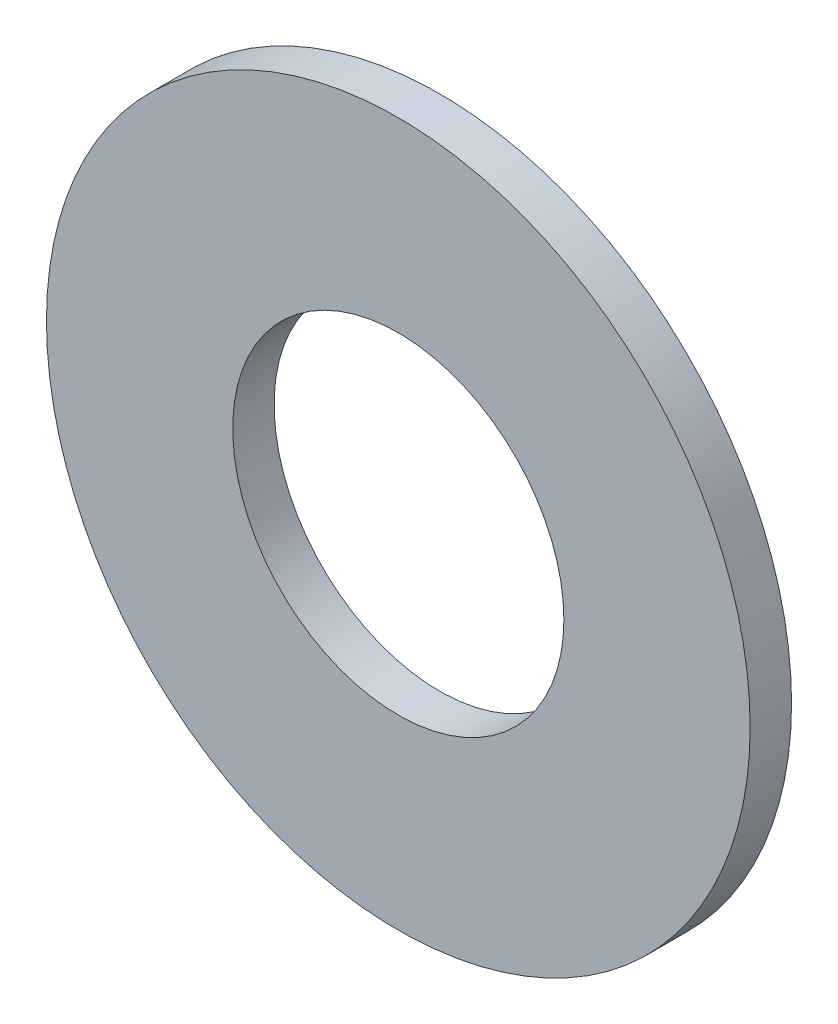
ISO-10303-21;
HEADER;
FILE_DESCRIPTION(('STEP AP214'),'2;1');
FILE_NAME('part.step','',(''),(''),'','','');
FILE_SCHEMA(('AUTOMOTIVE_DESIGN { 1 0 10303 214 1 1 1 1 }'));
ENDSEC;
DATA;
#1=APPLICATION_CONTEXT('core data for automotive mechanical design processes');
#2=APPLICATION_PROTOCOL_DEFINITION('international standard','automotive_design',2000,#1);
#3=PRODUCT_CONTEXT('',#1,'mechanical');
#4=PRODUCT('Part','Part','',(#3));
#5=PRODUCT_RELATED_PRODUCT_CATEGORY('part','',(#4));
#6=PRODUCT_DEFINITION_FORMATION('','',#4);
#7=PRODUCT_DEFINITION_CONTEXT('part definition',#1,'design');
#8=PRODUCT_DEFINITION('design','',#6,#7);
#9=PRODUCT_DEFINITION_SHAPE('','',#8);
#10=(LENGTH_UNIT() NAMED_UNIT(*) SI_UNIT(.MILLI.,.METRE.));
#11=(NAMED_UNIT(*) PLANE_ANGLE_UNIT() SI_UNIT($,.RADIAN.));
#12=(NAMED_UNIT(*) SI_UNIT($,.STERADIAN.) SOLID_ANGLE_UNIT());
#13=UNCERTAINTY_MEASURE_WITH_UNIT(LENGTH_MEASURE(1.E-05),#10,'distance_accuracy_value','');
#14=(GEOMETRIC_REPRESENTATION_CONTEXT(3) GLOBAL_UNCERTAINTY_ASSIGNED_CONTEXT((#13)) GLOBAL_UNIT_ASSIGNED_CONTEXT((#10,
#11,#12)) REPRESENTATION_CONTEXT('',''));
#15=CARTESIAN_POINT('',(0.,0.,0.));
#16=DIRECTION('',(0.,0.,1.));
#17=DIRECTION('',(1.,0.,0.));
#18=AXIS2_PLACEMENT_3D('',#15,#16,#17);
#19=CARTESIAN_POINT('',(0.,2.,-0.5));
#20=DIRECTION('',(0.,0.,-1.));
#21=DIRECTION('',(-1.,0.,0.));
#22=AXIS2_PLACEMENT_3D('',#19,#20,#21);
#23=PLANE('',#22);
#24=CARTESIAN_POINT('',(0.,0.,-0.5));
#25=DIRECTION('',(0.,0.,1.));
#26=DIRECTION('',(1.,0.,0.));
#27=AXIS2_PLACEMENT_3D('',#24,#25,#26);
#28=CIRCLE('',#27,2.);
#29=CARTESIAN_POINT('',(2.,0.,-0.5));
#30=VERTEX_POINT('',#29);
#31=EDGE_CURVE('E16',#30,#30,#28,.T.);
#32=ORIENTED_EDGE('',*,*,#31,.T.);
#33=EDGE_LOOP('',(#32));
#34=FACE_BOUND('',#33,.T.);
#35=CARTESIAN_POINT('',(0.,0.,-0.5));
#36=DIRECTION('',(0.,0.,1.));
#37=DIRECTION('',(1.,0.,0.));
#38=AXIS2_PLACEMENT_3D('',#35,#36,#37);
#39=CIRCLE('',#38,4.25);
#40=CARTESIAN_POINT('',(4.25,0.,-0.5));
#41=VERTEX_POINT('',#40);
#42=EDGE_CURVE('E25',#41,#41,#39,.T.);
#43=ORIENTED_EDGE('',*,*,#42,.F.);
#44=EDGE_LOOP('',(#43));
#45=FACE_BOUND('',#44,.T.);
#46=ADVANCED_FACE('F13',(#34,#45),#23,.T.);
#47=CARTESIAN_POINT('',(0.,0.,-0.5));
#48=DIRECTION('',(0.,0.,1.));
#49=DIRECTION('',(1.,0.,0.));
#50=AXIS2_PLACEMENT_3D('',#47,#48,#49);
#51=CYLINDRICAL_SURFACE('',#50,2.);
#52=CARTESIAN_POINT('',(0.,0.,0.));
#53=DIRECTION('',(0.,0.,1.));
#54=DIRECTION('',(1.,0.,0.));
#55=AXIS2_PLACEMENT_3D('',#52,#53,#54);
#56=CIRCLE('',#55,2.);
#57=CARTESIAN_POINT('',(2.,0.,0.));
#58=VERTEX_POINT('',#57);
#59=EDGE_CURVE('E20',#58,#58,#56,.F.);
#60=ORIENTED_EDGE('',*,*,#59,.F.);
#61=EDGE_LOOP('',(#60));
#62=FACE_BOUND('',#61,.T.);
#63=ORIENTED_EDGE('',*,*,#31,.F.);
#64=EDGE_LOOP('',(#63));
#65=FACE_BOUND('',#64,.T.);
#66=ADVANCED_FACE('F35',(#62,#65),#51,.F.);
#67=CARTESIAN_POINT('',(0.,0.,-0.5));
#68=DIRECTION('',(0.,0.,1.));
#69=DIRECTION('',(1.,0.,0.));
#70=AXIS2_PLACEMENT_3D('',#67,#68,#69);
#71=CYLINDRICAL_SURFACE('',#70,4.25);
#72=ORIENTED_EDGE('',*,*,#42,.T.);
#73=EDGE_LOOP('',(#72));
#74=FACE_BOUND('',#73,.T.);
#75=CARTESIAN_POINT('',(0.,0.,0.));
#76=DIRECTION('',(0.,0.,1.));
#77=DIRECTION('',(1.,0.,0.));
#78=AXIS2_PLACEMENT_3D('',#75,#76,#77);
#79=CIRCLE('',#78,4.25);
#80=CARTESIAN_POINT('',(4.25,0.,0.));
#81=VERTEX_POINT('',#80);
#82=EDGE_CURVE('E9',#81,#81,#79,.T.);
#83=ORIENTED_EDGE('',*,*,#82,.F.);
#84=EDGE_LOOP('',(#83));
#85=FACE_BOUND('',#84,.T.);
#86=ADVANCED_FACE('F37',(#74,#85),#71,.T.);
#87=CARTESIAN_POINT('',(0.,4.25,0.));
#88=DIRECTION('',(0.,0.,1.));
#89=DIRECTION('',(1.,0.,0.));
#90=AXIS2_PLACEMENT_3D('',#87,#88,#89);
#91=PLANE('',#90);
#92=ORIENTED_EDGE('',*,*,#82,.T.);
#93=EDGE_LOOP('',(#92));
#94=FACE_BOUND('',#93,.T.);
#95=ORIENTED_EDGE('',*,*,#59,.T.);
#96=EDGE_LOOP('',(#95));
#97=FACE_BOUND('',#96,.T.);
#98=ADVANCED_FACE('F44',(#94,#97),#91,.T.);
#99=CLOSED_SHELL('',(#46,#66,#86,#98));
#100=MANIFOLD_SOLID_BREP('B1',#99);
#101=ADVANCED_BREP_SHAPE_REPRESENTATION('',(#18,#100),#14);
#102=SHAPE_DEFINITION_REPRESENTATION(#9,#101);
ENDSEC;
END-ISO-10303-21;
